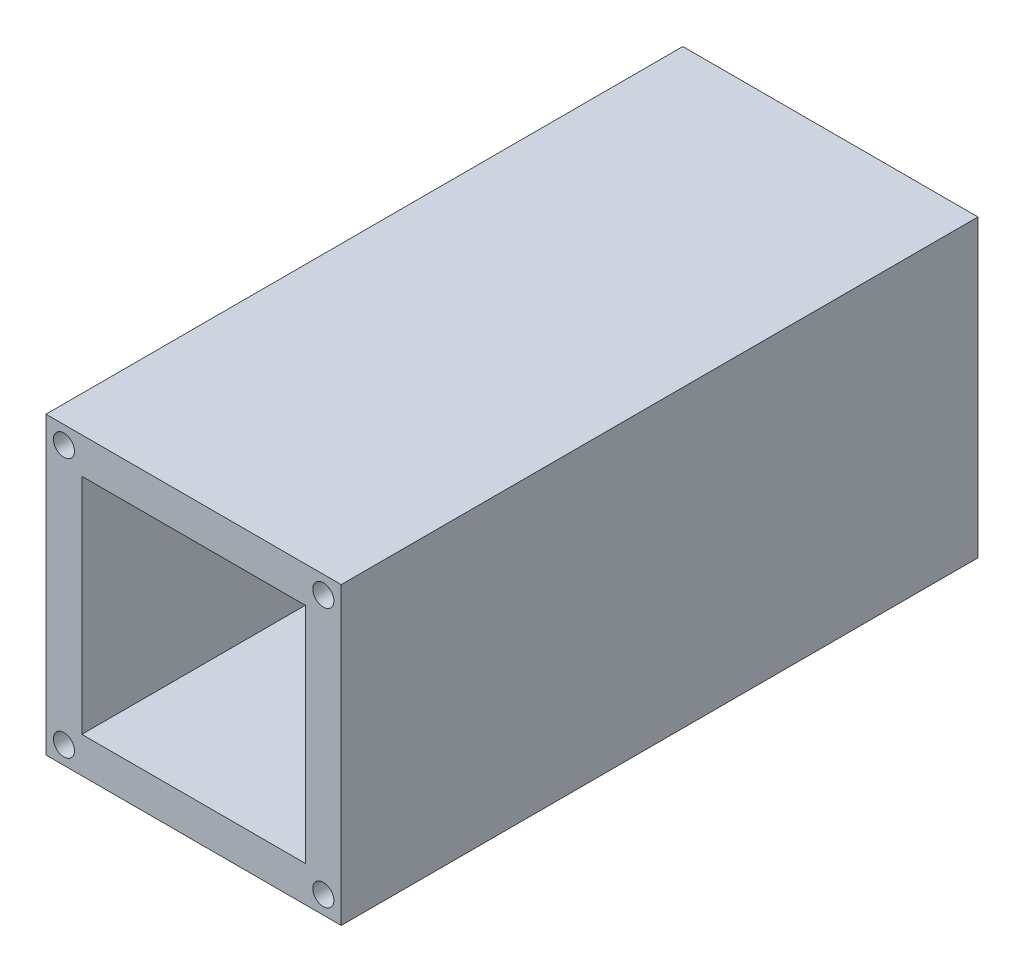
ISO-10303-21;
HEADER;
FILE_DESCRIPTION(('STEP AP214'),'2;1');
FILE_NAME('part.step','',(''),(''),'','','');
FILE_SCHEMA(('AUTOMOTIVE_DESIGN { 1 0 10303 214 1 1 1 1 }'));
ENDSEC;
DATA;
#1=APPLICATION_CONTEXT('core data for automotive mechanical design processes');
#2=APPLICATION_PROTOCOL_DEFINITION('international standard','automotive_design',2000,#1);
#3=PRODUCT_CONTEXT('',#1,'mechanical');
#4=PRODUCT('Part','Part','',(#3));
#5=PRODUCT_RELATED_PRODUCT_CATEGORY('part','',(#4));
#6=PRODUCT_DEFINITION_FORMATION('','',#4);
#7=PRODUCT_DEFINITION_CONTEXT('part definition',#1,'design');
#8=PRODUCT_DEFINITION('design','',#6,#7);
#9=PRODUCT_DEFINITION_SHAPE('','',#8);
#10=(LENGTH_UNIT() NAMED_UNIT(*) SI_UNIT(.MILLI.,.METRE.));
#11=(NAMED_UNIT(*) PLANE_ANGLE_UNIT() SI_UNIT($,.RADIAN.));
#12=(NAMED_UNIT(*) SI_UNIT($,.STERADIAN.) SOLID_ANGLE_UNIT());
#13=UNCERTAINTY_MEASURE_WITH_UNIT(LENGTH_MEASURE(1.E-05),#10,'distance_accuracy_value','');
#14=(GEOMETRIC_REPRESENTATION_CONTEXT(3) GLOBAL_UNCERTAINTY_ASSIGNED_CONTEXT((#13)) GLOBAL_UNIT_ASSIGNED_CONTEXT((#10,
#11,#12)) REPRESENTATION_CONTEXT('',''));
#15=CARTESIAN_POINT('',(0.,0.,0.));
#16=DIRECTION('',(0.,0.,1.));
#17=DIRECTION('',(1.,0.,0.));
#18=AXIS2_PLACEMENT_3D('',#15,#16,#17);
#19=CARTESIAN_POINT('',(0.,0.,37.));
#20=DIRECTION('',(0.,0.,1.));
#21=DIRECTION('',(1.,0.,0.));
#22=AXIS2_PLACEMENT_3D('',#19,#20,#21);
#23=PLANE('',#22);
#24=DIRECTION('',(0.,-1.,0.));
#25=VECTOR('',#24,1.);
#26=CARTESIAN_POINT('',(13.25,-13.25,37.));
#27=LINE('',#26,#25);
#28=CARTESIAN_POINT('',(13.25,-5.07229280254794,37.));
#29=VERTEX_POINT('',#28);
#30=CARTESIAN_POINT('',(13.25,-13.25,37.));
#31=VERTEX_POINT('',#30);
#32=EDGE_CURVE('E256',#29,#31,#27,.T.);
#33=ORIENTED_EDGE('',*,*,#32,.F.);
#34=DIRECTION('',(-0.809445742860398,-0.587194677568843,0.));
#35=VECTOR('',#34,1.);
#36=CARTESIAN_POINT('',(6.97944014943826,-9.62113304552116,37.));
#37=LINE('',#36,#35);
#38=CARTESIAN_POINT('',(8.314710178981,-8.65249066104956,37.));
#39=VERTEX_POINT('',#38);
#40=EDGE_CURVE('E207',#29,#39,#37,.T.);
#41=ORIENTED_EDGE('',*,*,#40,.T.);
#42=CARTESIAN_POINT('',(0.,2.80930729897218,37.));
#43=DIRECTION('',(0.,0.,1.));
#44=DIRECTION('',(1.,0.,0.));
#45=AXIS2_PLACEMENT_3D('',#42,#43,#44);
#46=CIRCLE('',#45,14.1600571268907);
#47=CARTESIAN_POINT('',(-8.314710178981,-8.65249066104956,37.));
#48=VERTEX_POINT('',#47);
#49=EDGE_CURVE('E175',#39,#48,#46,.F.);
#50=ORIENTED_EDGE('',*,*,#49,.T.);
#51=DIRECTION('',(0.809445742860399,-0.587194677568843,0.));
#52=VECTOR('',#51,1.);
#53=CARTESIAN_POINT('',(-6.97944014943825,-9.62113304552117,37.));
#54=LINE('',#53,#52);
#55=CARTESIAN_POINT('',(-13.25,-5.07229280254795,37.));
#56=VERTEX_POINT('',#55);
#57=EDGE_CURVE('E180',#56,#48,#54,.T.);
#58=ORIENTED_EDGE('',*,*,#57,.F.);
#59=DIRECTION('',(0.,1.,0.));
#60=VECTOR('',#59,1.);
#61=CARTESIAN_POINT('',(-13.25,-13.25,37.));
#62=LINE('',#61,#60);
#63=CARTESIAN_POINT('',(-13.25,-13.25,37.));
#64=VERTEX_POINT('',#63);
#65=EDGE_CURVE('E270',#64,#56,#62,.T.);
#66=ORIENTED_EDGE('',*,*,#65,.F.);
#67=DIRECTION('',(-1.,0.,0.));
#68=VECTOR('',#67,1.);
#69=CARTESIAN_POINT('',(13.25,-13.25,37.));
#70=LINE('',#69,#68);
#71=EDGE_CURVE('E266',#31,#64,#70,.T.);
#72=ORIENTED_EDGE('',*,*,#71,.F.);
#73=EDGE_LOOP('',(#33,#41,#50,#58,#66,#72));
#74=FACE_BOUND('',#73,.T.);
#75=ADVANCED_FACE('F35',(#74),#23,.T.);
#76=CARTESIAN_POINT('',(0.,0.,30.));
#77=DIRECTION('',(0.,0.,-1.));
#78=DIRECTION('',(-1.,0.,0.));
#79=AXIS2_PLACEMENT_3D('',#76,#77,#78);
#80=PLANE('',#79);
#81=DIRECTION('',(0.80379313045912,0.594908903469034,0.));
#82=VECTOR('',#81,1.);
#83=CARTESIAN_POINT('',(-7.08019389577977,9.56618934858924,30.));
#84=LINE('',#83,#82);
#85=CARTESIAN_POINT('',(-13.25,4.9997499937495,30.));
#86=VERTEX_POINT('',#85);
#87=CARTESIAN_POINT('',(-8.314710178981,8.65249066104956,30.));
#88=VERTEX_POINT('',#87);
#89=EDGE_CURVE('E203',#86,#88,#84,.T.);
#90=ORIENTED_EDGE('',*,*,#89,.F.);
#91=DIRECTION('',(0.,1.,0.));
#92=VECTOR('',#91,1.);
#93=CARTESIAN_POINT('',(-13.25,-13.25,30.));
#94=LINE('',#93,#92);
#95=CARTESIAN_POINT('',(-13.25,13.25,30.));
#96=VERTEX_POINT('',#95);
#97=EDGE_CURVE('E237',#86,#96,#94,.T.);
#98=ORIENTED_EDGE('',*,*,#97,.T.);
#99=DIRECTION('',(1.,0.,0.));
#100=VECTOR('',#99,1.);
#101=CARTESIAN_POINT('',(-13.25,13.25,30.));
#102=LINE('',#101,#100);
#103=CARTESIAN_POINT('',(13.25,13.25,30.));
#104=VERTEX_POINT('',#103);
#105=EDGE_CURVE('E240',#96,#104,#102,.T.);
#106=ORIENTED_EDGE('',*,*,#105,.T.);
#107=DIRECTION('',(0.,-1.,0.));
#108=VECTOR('',#107,1.);
#109=CARTESIAN_POINT('',(13.25,-13.25,30.));
#110=LINE('',#109,#108);
#111=CARTESIAN_POINT('',(13.25,4.99974999374959,30.));
#112=VERTEX_POINT('',#111);
#113=EDGE_CURVE('E230',#104,#112,#110,.T.);
#114=ORIENTED_EDGE('',*,*,#113,.T.);
#115=DIRECTION('',(-0.80379313045912,0.594908903469034,0.));
#116=VECTOR('',#115,1.);
#117=CARTESIAN_POINT('',(7.08019389577977,9.56618934858924,30.));
#118=LINE('',#117,#116);
#119=CARTESIAN_POINT('',(8.314710178981,8.65249066104955,30.));
#120=VERTEX_POINT('',#119);
#121=EDGE_CURVE('E195',#112,#120,#118,.T.);
#122=ORIENTED_EDGE('',*,*,#121,.T.);
#123=CARTESIAN_POINT('',(0.,-2.58167793964163,30.));
#124=DIRECTION('',(0.,0.,-1.));
#125=DIRECTION('',(-1.,0.,0.));
#126=AXIS2_PLACEMENT_3D('',#123,#124,#125);
#127=CIRCLE('',#126,13.9764426628955);
#128=EDGE_CURVE('E200',#88,#120,#127,.T.);
#129=ORIENTED_EDGE('',*,*,#128,.F.);
#130=EDGE_LOOP('',(#90,#98,#106,#114,#122,#129));
#131=FACE_BOUND('',#130,.T.);
#132=ADVANCED_FACE('F395',(#131),#80,.T.);
#133=CARTESIAN_POINT('',(-17.5,-17.5,75.5));
#134=DIRECTION('',(1.,0.,0.));
#135=DIRECTION('',(0.,0.,-1.));
#136=AXIS2_PLACEMENT_3D('',#133,#134,#135);
#137=PLANE('',#136);
#138=DIRECTION('',(0.,-1.,0.));
#139=VECTOR('',#138,1.);
#140=CARTESIAN_POINT('',(-17.5,-17.5,0.));
#141=LINE('',#140,#139);
#142=CARTESIAN_POINT('',(-17.5,17.5,0.));
#143=VERTEX_POINT('',#142);
#144=CARTESIAN_POINT('',(-17.5,-17.5,0.));
#145=VERTEX_POINT('',#144);
#146=EDGE_CURVE('E339',#143,#145,#141,.T.);
#147=ORIENTED_EDGE('',*,*,#146,.T.);
#148=DIRECTION('',(0.,0.,-1.));
#149=VECTOR('',#148,1.);
#150=CARTESIAN_POINT('',(-17.5,-17.5,75.5));
#151=LINE('',#150,#149);
#152=CARTESIAN_POINT('',(-17.5,-17.5,75.5));
#153=VERTEX_POINT('',#152);
#154=EDGE_CURVE('E11',#153,#145,#151,.T.);
#155=ORIENTED_EDGE('',*,*,#154,.F.);
#156=DIRECTION('',(0.,-1.,0.));
#157=VECTOR('',#156,1.);
#158=CARTESIAN_POINT('',(-17.5,-17.5,75.5));
#159=LINE('',#158,#157);
#160=CARTESIAN_POINT('',(-17.5,17.5,75.5));
#161=VERTEX_POINT('',#160);
#162=EDGE_CURVE('E345',#161,#153,#159,.T.);
#163=ORIENTED_EDGE('',*,*,#162,.F.);
#164=DIRECTION('',(0.,0.,-1.));
#165=VECTOR('',#164,1.);
#166=CARTESIAN_POINT('',(-17.5,17.5,75.5));
#167=LINE('',#166,#165);
#168=EDGE_CURVE('E355',#161,#143,#167,.T.);
#169=ORIENTED_EDGE('',*,*,#168,.T.);
#170=EDGE_LOOP('',(#147,#155,#163,#169));
#171=FACE_BOUND('',#170,.T.);
#172=ADVANCED_FACE('F37',(#171),#137,.F.);
#173=CARTESIAN_POINT('',(17.5,-17.5,75.5));
#174=DIRECTION('',(0.,1.,0.));
#175=DIRECTION('',(-1.,0.,0.));
#176=AXIS2_PLACEMENT_3D('',#173,#174,#175);
#177=PLANE('',#176);
#178=DIRECTION('',(1.,0.,0.));
#179=VECTOR('',#178,1.);
#180=CARTESIAN_POINT('',(17.5,-17.5,0.));
#181=LINE('',#180,#179);
#182=CARTESIAN_POINT('',(17.5,-17.5,0.));
#183=VERTEX_POINT('',#182);
#184=EDGE_CURVE('E358',#145,#183,#181,.T.);
#185=ORIENTED_EDGE('',*,*,#184,.T.);
#186=DIRECTION('',(0.,0.,-1.));
#187=VECTOR('',#186,1.);
#188=CARTESIAN_POINT('',(17.5,-17.5,75.5));
#189=LINE('',#188,#187);
#190=CARTESIAN_POINT('',(17.5,-17.5,75.5));
#191=VERTEX_POINT('',#190);
#192=EDGE_CURVE('E43',#191,#183,#189,.T.);
#193=ORIENTED_EDGE('',*,*,#192,.F.);
#194=DIRECTION('',(1.,0.,0.));
#195=VECTOR('',#194,1.);
#196=CARTESIAN_POINT('',(17.5,-17.5,75.5));
#197=LINE('',#196,#195);
#198=EDGE_CURVE('E348',#153,#191,#197,.T.);
#199=ORIENTED_EDGE('',*,*,#198,.F.);
#200=ORIENTED_EDGE('',*,*,#154,.T.);
#201=EDGE_LOOP('',(#185,#193,#199,#200));
#202=FACE_BOUND('',#201,.T.);
#203=ADVANCED_FACE('F388',(#202),#177,.F.);
#204=CARTESIAN_POINT('',(17.5,-17.5,75.5));
#205=DIRECTION('',(-1.,0.,0.));
#206=DIRECTION('',(0.,-1.,0.));
#207=AXIS2_PLACEMENT_3D('',#204,#205,#206);
#208=PLANE('',#207);
#209=DIRECTION('',(0.,1.,0.));
#210=VECTOR('',#209,1.);
#211=CARTESIAN_POINT('',(17.5,-17.5,0.));
#212=LINE('',#211,#210);
#213=CARTESIAN_POINT('',(17.5,17.5,0.));
#214=VERTEX_POINT('',#213);
#215=EDGE_CURVE('E360',#183,#214,#212,.T.);
#216=ORIENTED_EDGE('',*,*,#215,.T.);
#217=DIRECTION('',(0.,0.,-1.));
#218=VECTOR('',#217,1.);
#219=CARTESIAN_POINT('',(17.5,17.5,75.5));
#220=LINE('',#219,#218);
#221=CARTESIAN_POINT('',(17.5,17.5,75.5));
#222=VERTEX_POINT('',#221);
#223=EDGE_CURVE('E365',#222,#214,#220,.T.);
#224=ORIENTED_EDGE('',*,*,#223,.F.);
#225=DIRECTION('',(0.,1.,0.));
#226=VECTOR('',#225,1.);
#227=CARTESIAN_POINT('',(17.5,-17.5,75.5));
#228=LINE('',#227,#226);
#229=EDGE_CURVE('E351',#191,#222,#228,.T.);
#230=ORIENTED_EDGE('',*,*,#229,.F.);
#231=ORIENTED_EDGE('',*,*,#192,.T.);
#232=EDGE_LOOP('',(#216,#224,#230,#231));
#233=FACE_BOUND('',#232,.T.);
#234=ADVANCED_FACE('F372',(#233),#208,.F.);
#235=CARTESIAN_POINT('',(17.5,17.5,75.5));
#236=DIRECTION('',(0.,-1.,0.));
#237=DIRECTION('',(1.,0.,0.));
#238=AXIS2_PLACEMENT_3D('',#235,#236,#237);
#239=PLANE('',#238);
#240=DIRECTION('',(-1.,0.,0.));
#241=VECTOR('',#240,1.);
#242=CARTESIAN_POINT('',(17.5,17.5,0.));
#243=LINE('',#242,#241);
#244=EDGE_CURVE('E349',#214,#143,#243,.T.);
#245=ORIENTED_EDGE('',*,*,#244,.T.);
#246=ORIENTED_EDGE('',*,*,#168,.F.);
#247=DIRECTION('',(-1.,0.,0.));
#248=VECTOR('',#247,1.);
#249=CARTESIAN_POINT('',(17.5,17.5,75.5));
#250=LINE('',#249,#248);
#251=EDGE_CURVE('E353',#222,#161,#250,.T.);
#252=ORIENTED_EDGE('',*,*,#251,.F.);
#253=ORIENTED_EDGE('',*,*,#223,.T.);
#254=EDGE_LOOP('',(#245,#246,#252,#253));
#255=FACE_BOUND('',#254,.T.);
#256=ADVANCED_FACE('F381',(#255),#239,.F.);
#257=CARTESIAN_POINT('',(0.,0.,75.5));
#258=DIRECTION('',(0.,0.,1.));
#259=DIRECTION('',(1.,0.,0.));
#260=AXIS2_PLACEMENT_3D('',#257,#258,#259);
#261=PLANE('',#260);
#262=CARTESIAN_POINT('',(-15.375,-15.38,75.5));
#263=DIRECTION('',(0.,0.,1.));
#264=DIRECTION('',(1.,0.,0.));
#265=AXIS2_PLACEMENT_3D('',#262,#263,#264);
#266=CIRCLE('',#265,1.25);
#267=CARTESIAN_POINT('',(-14.125,-15.38,75.5));
#268=VERTEX_POINT('',#267);
#269=EDGE_CURVE('E298',#268,#268,#266,.T.);
#270=ORIENTED_EDGE('',*,*,#269,.F.);
#271=EDGE_LOOP('',(#270));
#272=FACE_BOUND('',#271,.T.);
#273=CARTESIAN_POINT('',(15.38,-15.38,75.5));
#274=DIRECTION('',(0.,0.,1.));
#275=DIRECTION('',(1.,0.,0.));
#276=AXIS2_PLACEMENT_3D('',#273,#274,#275);
#277=CIRCLE('',#276,1.25);
#278=CARTESIAN_POINT('',(16.63,-15.38,75.5));
#279=VERTEX_POINT('',#278);
#280=EDGE_CURVE('E311',#279,#279,#277,.T.);
#281=ORIENTED_EDGE('',*,*,#280,.F.);
#282=EDGE_LOOP('',(#281));
#283=FACE_BOUND('',#282,.T.);
#284=CARTESIAN_POINT('',(15.38,15.38,75.5));
#285=DIRECTION('',(0.,0.,1.));
#286=DIRECTION('',(1.,0.,0.));
#287=AXIS2_PLACEMENT_3D('',#284,#285,#286);
#288=CIRCLE('',#287,1.25);
#289=CARTESIAN_POINT('',(16.63,15.38,75.5));
#290=VERTEX_POINT('',#289);
#291=EDGE_CURVE('E305',#290,#290,#288,.T.);
#292=ORIENTED_EDGE('',*,*,#291,.F.);
#293=EDGE_LOOP('',(#292));
#294=FACE_BOUND('',#293,.T.);
#295=CARTESIAN_POINT('',(-15.375,15.38,75.5));
#296=DIRECTION('',(0.,0.,1.));
#297=DIRECTION('',(1.,0.,0.));
#298=AXIS2_PLACEMENT_3D('',#295,#296,#297);
#299=CIRCLE('',#298,1.25);
#300=CARTESIAN_POINT('',(-14.125,15.38,75.5));
#301=VERTEX_POINT('',#300);
#302=EDGE_CURVE('E304',#301,#301,#299,.T.);
#303=ORIENTED_EDGE('',*,*,#302,.F.);
#304=EDGE_LOOP('',(#303));
#305=FACE_BOUND('',#304,.T.);
#306=DIRECTION('',(0.,-1.,0.));
#307=VECTOR('',#306,1.);
#308=CARTESIAN_POINT('',(-13.25,-13.25,75.5));
#309=LINE('',#308,#307);
#310=CARTESIAN_POINT('',(-13.25,13.25,75.5));
#311=VERTEX_POINT('',#310);
#312=CARTESIAN_POINT('',(-13.25,-13.25,75.5));
#313=VERTEX_POINT('',#312);
#314=EDGE_CURVE('E322',#311,#313,#309,.T.);
#315=ORIENTED_EDGE('',*,*,#314,.F.);
#316=DIRECTION('',(-1.,0.,0.));
#317=VECTOR('',#316,1.);
#318=CARTESIAN_POINT('',(13.25,13.25,75.5));
#319=LINE('',#318,#317);
#320=CARTESIAN_POINT('',(13.25,13.25,75.5));
#321=VERTEX_POINT('',#320);
#322=EDGE_CURVE('E333',#321,#311,#319,.T.);
#323=ORIENTED_EDGE('',*,*,#322,.F.);
#324=DIRECTION('',(0.,1.,0.));
#325=VECTOR('',#324,1.);
#326=CARTESIAN_POINT('',(13.25,-13.25,75.5));
#327=LINE('',#326,#325);
#328=CARTESIAN_POINT('',(13.25,-13.25,75.5));
#329=VERTEX_POINT('',#328);
#330=EDGE_CURVE('E330',#329,#321,#327,.T.);
#331=ORIENTED_EDGE('',*,*,#330,.F.);
#332=DIRECTION('',(1.,0.,0.));
#333=VECTOR('',#332,1.);
#334=CARTESIAN_POINT('',(13.25,-13.25,75.5));
#335=LINE('',#334,#333);
#336=EDGE_CURVE('E327',#313,#329,#335,.T.);
#337=ORIENTED_EDGE('',*,*,#336,.F.);
#338=EDGE_LOOP('',(#315,#323,#331,#337));
#339=FACE_BOUND('',#338,.T.);
#340=ORIENTED_EDGE('',*,*,#162,.T.);
#341=ORIENTED_EDGE('',*,*,#198,.T.);
#342=ORIENTED_EDGE('',*,*,#229,.T.);
#343=ORIENTED_EDGE('',*,*,#251,.T.);
#344=EDGE_LOOP('',(#340,#341,#342,#343));
#345=FACE_BOUND('',#344,.T.);
#346=ADVANCED_FACE('F387',(#272,#283,#294,#305,#339,#345),#261,.T.);
#347=CARTESIAN_POINT('',(0.,0.,0.));
#348=DIRECTION('',(0.,0.,1.));
#349=DIRECTION('',(1.,0.,0.));
#350=AXIS2_PLACEMENT_3D('',#347,#348,#349);
#351=PLANE('',#350);
#352=DIRECTION('',(-1.,0.,0.));
#353=VECTOR('',#352,1.);
#354=CARTESIAN_POINT('',(-13.25,-13.25,0.));
#355=LINE('',#354,#353);
#356=CARTESIAN_POINT('',(13.25,-13.25,0.));
#357=VERTEX_POINT('',#356);
#358=CARTESIAN_POINT('',(-13.25,-13.25,0.));
#359=VERTEX_POINT('',#358);
#360=EDGE_CURVE('E245',#357,#359,#355,.T.);
#361=ORIENTED_EDGE('',*,*,#360,.F.);
#362=DIRECTION('',(0.,-1.,0.));
#363=VECTOR('',#362,1.);
#364=CARTESIAN_POINT('',(13.25,-13.25,0.));
#365=LINE('',#364,#363);
#366=CARTESIAN_POINT('',(13.25,13.25,0.));
#367=VERTEX_POINT('',#366);
#368=EDGE_CURVE('E187',#367,#357,#365,.T.);
#369=ORIENTED_EDGE('',*,*,#368,.F.);
#370=DIRECTION('',(1.,0.,0.));
#371=VECTOR('',#370,1.);
#372=CARTESIAN_POINT('',(-13.25,13.25,0.));
#373=LINE('',#372,#371);
#374=CARTESIAN_POINT('',(-13.25,13.25,0.));
#375=VERTEX_POINT('',#374);
#376=EDGE_CURVE('E251',#375,#367,#373,.T.);
#377=ORIENTED_EDGE('',*,*,#376,.F.);
#378=DIRECTION('',(0.,1.,0.));
#379=VECTOR('',#378,1.);
#380=CARTESIAN_POINT('',(-13.25,-13.25,0.));
#381=LINE('',#380,#379);
#382=EDGE_CURVE('E248',#359,#375,#381,.T.);
#383=ORIENTED_EDGE('',*,*,#382,.F.);
#384=EDGE_LOOP('',(#361,#369,#377,#383));
#385=FACE_BOUND('',#384,.T.);
#386=CARTESIAN_POINT('',(15.38,-15.38,0.));
#387=DIRECTION('',(0.,0.,-1.));
#388=DIRECTION('',(-1.,0.,0.));
#389=AXIS2_PLACEMENT_3D('',#386,#387,#388);
#390=CIRCLE('',#389,1.25);
#391=CARTESIAN_POINT('',(14.13,-15.38,0.));
#392=VERTEX_POINT('',#391);
#393=EDGE_CURVE('E276',#392,#392,#390,.T.);
#394=ORIENTED_EDGE('',*,*,#393,.F.);
#395=EDGE_LOOP('',(#394));
#396=FACE_BOUND('',#395,.T.);
#397=CARTESIAN_POINT('',(-15.38,-15.38,0.));
#398=DIRECTION('',(0.,0.,-1.));
#399=DIRECTION('',(-1.,0.,0.));
#400=AXIS2_PLACEMENT_3D('',#397,#398,#399);
#401=CIRCLE('',#400,1.25);
#402=CARTESIAN_POINT('',(-16.63,-15.38,0.));
#403=VERTEX_POINT('',#402);
#404=EDGE_CURVE('E287',#403,#403,#401,.T.);
#405=ORIENTED_EDGE('',*,*,#404,.F.);
#406=EDGE_LOOP('',(#405));
#407=FACE_BOUND('',#406,.T.);
#408=CARTESIAN_POINT('',(-15.38,15.38,0.));
#409=DIRECTION('',(0.,0.,-1.));
#410=DIRECTION('',(-1.,0.,0.));
#411=AXIS2_PLACEMENT_3D('',#408,#409,#410);
#412=CIRCLE('',#411,1.25);
#413=CARTESIAN_POINT('',(-16.63,15.38,0.));
#414=VERTEX_POINT('',#413);
#415=EDGE_CURVE('E281',#414,#414,#412,.T.);
#416=ORIENTED_EDGE('',*,*,#415,.F.);
#417=EDGE_LOOP('',(#416));
#418=FACE_BOUND('',#417,.T.);
#419=CARTESIAN_POINT('',(15.38,15.38,0.));
#420=DIRECTION('',(0.,0.,-1.));
#421=DIRECTION('',(-1.,0.,0.));
#422=AXIS2_PLACEMENT_3D('',#419,#420,#421);
#423=CIRCLE('',#422,1.25);
#424=CARTESIAN_POINT('',(14.13,15.38,0.));
#425=VERTEX_POINT('',#424);
#426=EDGE_CURVE('E280',#425,#425,#423,.T.);
#427=ORIENTED_EDGE('',*,*,#426,.F.);
#428=EDGE_LOOP('',(#427));
#429=FACE_BOUND('',#428,.T.);
#430=ORIENTED_EDGE('',*,*,#146,.F.);
#431=ORIENTED_EDGE('',*,*,#244,.F.);
#432=ORIENTED_EDGE('',*,*,#215,.F.);
#433=ORIENTED_EDGE('',*,*,#184,.F.);
#434=EDGE_LOOP('',(#430,#431,#432,#433));
#435=FACE_BOUND('',#434,.T.);
#436=ADVANCED_FACE('F378',(#385,#396,#407,#418,#429,#435),#351,.F.);
#437=CARTESIAN_POINT('',(-13.25,-13.25,-4.5));
#438=DIRECTION('',(-1.,0.,0.));
#439=DIRECTION('',(0.,0.,1.));
#440=AXIS2_PLACEMENT_3D('',#437,#438,#439);
#441=PLANE('',#440);
#442=DIRECTION('',(0.,0.,1.));
#443=VECTOR('',#442,1.);
#444=CARTESIAN_POINT('',(-13.25,-13.25,-4.5));
#445=LINE('',#444,#443);
#446=EDGE_CURVE('E336',#64,#313,#445,.T.);
#447=ORIENTED_EDGE('',*,*,#446,.F.);
#448=ORIENTED_EDGE('',*,*,#65,.T.);
#449=DIRECTION('',(0.,0.,1.));
#450=VECTOR('',#449,1.);
#451=CARTESIAN_POINT('',(-13.25,-5.07229280254795,-0.001000000000001));
#452=LINE('',#451,#450);
#453=CARTESIAN_POINT('',(-13.25,-5.07229280254795,30.));
#454=VERTEX_POINT('',#453);
#455=EDGE_CURVE('E50',#454,#56,#452,.T.);
#456=ORIENTED_EDGE('',*,*,#455,.F.);
#457=CARTESIAN_POINT('',(-13.25,-13.25,30.));
#458=VERTEX_POINT('',#457);
#459=EDGE_CURVE('E238',#458,#454,#94,.T.);
#460=ORIENTED_EDGE('',*,*,#459,.F.);
#461=DIRECTION('',(0.,0.,-1.));
#462=VECTOR('',#461,1.);
#463=CARTESIAN_POINT('',(-13.25,-13.25,30.));
#464=LINE('',#463,#462);
#465=EDGE_CURVE('E259',#458,#359,#464,.T.);
#466=ORIENTED_EDGE('',*,*,#465,.T.);
#467=ORIENTED_EDGE('',*,*,#382,.T.);
#468=DIRECTION('',(0.,0.,-1.));
#469=VECTOR('',#468,1.);
#470=CARTESIAN_POINT('',(-13.25,13.25,30.));
#471=LINE('',#470,#469);
#472=EDGE_CURVE('E257',#96,#375,#471,.T.);
#473=ORIENTED_EDGE('',*,*,#472,.F.);
#474=ORIENTED_EDGE('',*,*,#97,.F.);
#475=DIRECTION('',(0.,0.,1.));
#476=VECTOR('',#475,1.);
#477=CARTESIAN_POINT('',(-13.25,4.9997499937495,-0.001000000000001));
#478=LINE('',#477,#476);
#479=CARTESIAN_POINT('',(-13.25,4.9997499937495,37.));
#480=VERTEX_POINT('',#479);
#481=EDGE_CURVE('E221',#86,#480,#478,.T.);
#482=ORIENTED_EDGE('',*,*,#481,.T.);
#483=CARTESIAN_POINT('',(-13.25,13.25,37.));
#484=VERTEX_POINT('',#483);
#485=EDGE_CURVE('E269',#480,#484,#62,.T.);
#486=ORIENTED_EDGE('',*,*,#485,.T.);
#487=DIRECTION('',(0.,0.,1.));
#488=VECTOR('',#487,1.);
#489=CARTESIAN_POINT('',(-13.25,13.25,-4.5));
#490=LINE('',#489,#488);
#491=EDGE_CURVE('E337',#484,#311,#490,.T.);
#492=ORIENTED_EDGE('',*,*,#491,.T.);
#493=ORIENTED_EDGE('',*,*,#314,.T.);
#494=EDGE_LOOP('',(#447,#448,#456,#460,#466,#467,#473,#474,#482,#486,#492,#493));
#495=FACE_BOUND('',#494,.T.);
#496=ADVANCED_FACE('F441',(#495),#441,.F.);
#497=CARTESIAN_POINT('',(13.25,13.25,-4.5));
#498=DIRECTION('',(0.,1.,0.));
#499=DIRECTION('',(-1.,0.,0.));
#500=AXIS2_PLACEMENT_3D('',#497,#498,#499);
#501=PLANE('',#500);
#502=ORIENTED_EDGE('',*,*,#491,.F.);
#503=DIRECTION('',(1.,0.,0.));
#504=VECTOR('',#503,1.);
#505=CARTESIAN_POINT('',(13.25,13.25,37.));
#506=LINE('',#505,#504);
#507=CARTESIAN_POINT('',(13.25,13.25,37.));
#508=VERTEX_POINT('',#507);
#509=EDGE_CURVE('E273',#484,#508,#506,.T.);
#510=ORIENTED_EDGE('',*,*,#509,.T.);
#511=DIRECTION('',(0.,0.,1.));
#512=VECTOR('',#511,1.);
#513=CARTESIAN_POINT('',(13.25,13.25,-4.5));
#514=LINE('',#513,#512);
#515=EDGE_CURVE('E340',#508,#321,#514,.T.);
#516=ORIENTED_EDGE('',*,*,#515,.T.);
#517=ORIENTED_EDGE('',*,*,#322,.T.);
#518=EDGE_LOOP('',(#502,#510,#516,#517));
#519=FACE_BOUND('',#518,.T.);
#520=ADVANCED_FACE('F435',(#519),#501,.F.);
#521=CARTESIAN_POINT('',(13.25,-13.25,-4.5));
#522=DIRECTION('',(1.,0.,0.));
#523=DIRECTION('',(0.,0.,-1.));
#524=AXIS2_PLACEMENT_3D('',#521,#522,#523);
#525=PLANE('',#524);
#526=ORIENTED_EDGE('',*,*,#515,.F.);
#527=CARTESIAN_POINT('',(13.25,4.99974999374959,37.));
#528=VERTEX_POINT('',#527);
#529=EDGE_CURVE('E263',#508,#528,#27,.T.);
#530=ORIENTED_EDGE('',*,*,#529,.T.);
#531=DIRECTION('',(0.,0.,1.));
#532=VECTOR('',#531,1.);
#533=CARTESIAN_POINT('',(13.25,4.99974999374959,-0.001000000000001));
#534=LINE('',#533,#532);
#535=EDGE_CURVE('E227',#112,#528,#534,.T.);
#536=ORIENTED_EDGE('',*,*,#535,.F.);
#537=ORIENTED_EDGE('',*,*,#113,.F.);
#538=DIRECTION('',(0.,0.,-1.));
#539=VECTOR('',#538,1.);
#540=CARTESIAN_POINT('',(13.25,13.25,30.));
#541=LINE('',#540,#539);
#542=EDGE_CURVE('E254',#104,#367,#541,.T.);
#543=ORIENTED_EDGE('',*,*,#542,.T.);
#544=ORIENTED_EDGE('',*,*,#368,.T.);
#545=DIRECTION('',(0.,0.,-1.));
#546=VECTOR('',#545,1.);
#547=CARTESIAN_POINT('',(13.25,-13.25,30.));
#548=LINE('',#547,#546);
#549=CARTESIAN_POINT('',(13.25,-13.25,30.));
#550=VERTEX_POINT('',#549);
#551=EDGE_CURVE('E243',#550,#357,#548,.T.);
#552=ORIENTED_EDGE('',*,*,#551,.F.);
#553=CARTESIAN_POINT('',(13.25,-5.07229280254794,30.));
#554=VERTEX_POINT('',#553);
#555=EDGE_CURVE('E234',#554,#550,#110,.T.);
#556=ORIENTED_EDGE('',*,*,#555,.F.);
#557=DIRECTION('',(0.,0.,1.));
#558=VECTOR('',#557,1.);
#559=CARTESIAN_POINT('',(13.25,-5.07229280254794,-0.001000000000001));
#560=LINE('',#559,#558);
#561=EDGE_CURVE('E179',#554,#29,#560,.T.);
#562=ORIENTED_EDGE('',*,*,#561,.T.);
#563=ORIENTED_EDGE('',*,*,#32,.T.);
#564=DIRECTION('',(0.,0.,1.));
#565=VECTOR('',#564,1.);
#566=CARTESIAN_POINT('',(13.25,-13.25,-4.5));
#567=LINE('',#566,#565);
#568=EDGE_CURVE('E342',#31,#329,#567,.T.);
#569=ORIENTED_EDGE('',*,*,#568,.T.);
#570=ORIENTED_EDGE('',*,*,#330,.T.);
#571=EDGE_LOOP('',(#526,#530,#536,#537,#543,#544,#552,#556,#562,#563,#569,#570));
#572=FACE_BOUND('',#571,.T.);
#573=ADVANCED_FACE('F428',(#572),#525,.F.);
#574=CARTESIAN_POINT('',(13.25,-13.25,-4.5));
#575=DIRECTION('',(0.,-1.,0.));
#576=DIRECTION('',(1.,0.,0.));
#577=AXIS2_PLACEMENT_3D('',#574,#575,#576);
#578=PLANE('',#577);
#579=ORIENTED_EDGE('',*,*,#568,.F.);
#580=ORIENTED_EDGE('',*,*,#71,.T.);
#581=ORIENTED_EDGE('',*,*,#446,.T.);
#582=ORIENTED_EDGE('',*,*,#336,.T.);
#583=EDGE_LOOP('',(#579,#580,#581,#582));
#584=FACE_BOUND('',#583,.T.);
#585=ADVANCED_FACE('F467',(#584),#578,.F.);
#586=CARTESIAN_POINT('',(-15.375,15.38,65.5));
#587=DIRECTION('',(0.,0.,1.));
#588=DIRECTION('',(1.,0.,0.));
#589=AXIS2_PLACEMENT_3D('',#586,#587,#588);
#590=CYLINDRICAL_SURFACE('',#589,1.25);
#591=CARTESIAN_POINT('',(-15.375,15.38,65.5));
#592=DIRECTION('',(0.,0.,1.));
#593=DIRECTION('',(1.,0.,0.));
#594=AXIS2_PLACEMENT_3D('',#591,#592,#593);
#595=CIRCLE('',#594,1.25);
#596=CARTESIAN_POINT('',(-14.125,15.38,65.5));
#597=VERTEX_POINT('',#596);
#598=EDGE_CURVE('E319',#597,#597,#595,.T.);
#599=ORIENTED_EDGE('',*,*,#598,.F.);
#600=EDGE_LOOP('',(#599));
#601=FACE_BOUND('',#600,.T.);
#602=ORIENTED_EDGE('',*,*,#302,.T.);
#603=EDGE_LOOP('',(#602));
#604=FACE_BOUND('',#603,.T.);
#605=ADVANCED_FACE('F485',(#601,#604),#590,.F.);
#606=CARTESIAN_POINT('',(-15.375,15.38,65.5));
#607=DIRECTION('',(0.,0.,1.));
#608=DIRECTION('',(1.,0.,0.));
#609=AXIS2_PLACEMENT_3D('',#606,#607,#608);
#610=PLANE('',#609);
#611=ORIENTED_EDGE('',*,*,#598,.T.);
#612=EDGE_LOOP('',(#611));
#613=FACE_BOUND('',#612,.T.);
#614=ADVANCED_FACE('F492',(#613),#610,.T.);
#615=CARTESIAN_POINT('',(15.38,15.38,65.5));
#616=DIRECTION('',(0.,0.,1.));
#617=DIRECTION('',(1.,0.,0.));
#618=AXIS2_PLACEMENT_3D('',#615,#616,#617);
#619=CYLINDRICAL_SURFACE('',#618,1.25);
#620=CARTESIAN_POINT('',(15.38,15.38,65.5));
#621=DIRECTION('',(0.,0.,1.));
#622=DIRECTION('',(1.,0.,0.));
#623=AXIS2_PLACEMENT_3D('',#620,#621,#622);
#624=CIRCLE('',#623,1.25);
#625=CARTESIAN_POINT('',(16.63,15.38,65.5));
#626=VERTEX_POINT('',#625);
#627=EDGE_CURVE('E301',#626,#626,#624,.T.);
#628=ORIENTED_EDGE('',*,*,#627,.F.);
#629=EDGE_LOOP('',(#628));
#630=FACE_BOUND('',#629,.T.);
#631=ORIENTED_EDGE('',*,*,#291,.T.);
#632=EDGE_LOOP('',(#631));
#633=FACE_BOUND('',#632,.T.);
#634=ADVANCED_FACE('F496',(#630,#633),#619,.F.);
#635=CARTESIAN_POINT('',(15.38,15.38,65.5));
#636=DIRECTION('',(0.,0.,1.));
#637=DIRECTION('',(1.,0.,0.));
#638=AXIS2_PLACEMENT_3D('',#635,#636,#637);
#639=PLANE('',#638);
#640=ORIENTED_EDGE('',*,*,#627,.T.);
#641=EDGE_LOOP('',(#640));
#642=FACE_BOUND('',#641,.T.);
#643=ADVANCED_FACE('F511',(#642),#639,.T.);
#644=CARTESIAN_POINT('',(15.38,-15.38,65.5));
#645=DIRECTION('',(0.,0.,1.));
#646=DIRECTION('',(1.,0.,0.));
#647=AXIS2_PLACEMENT_3D('',#644,#645,#646);
#648=CYLINDRICAL_SURFACE('',#647,1.25);
#649=CARTESIAN_POINT('',(15.38,-15.38,65.5));
#650=DIRECTION('',(0.,0.,1.));
#651=DIRECTION('',(1.,0.,0.));
#652=AXIS2_PLACEMENT_3D('',#649,#650,#651);
#653=CIRCLE('',#652,1.25);
#654=CARTESIAN_POINT('',(16.63,-15.38,65.5));
#655=VERTEX_POINT('',#654);
#656=EDGE_CURVE('E308',#655,#655,#653,.T.);
#657=ORIENTED_EDGE('',*,*,#656,.F.);
#658=EDGE_LOOP('',(#657));
#659=FACE_BOUND('',#658,.T.);
#660=ORIENTED_EDGE('',*,*,#280,.T.);
#661=EDGE_LOOP('',(#660));
#662=FACE_BOUND('',#661,.T.);
#663=ADVANCED_FACE('F508',(#659,#662),#648,.F.);
#664=CARTESIAN_POINT('',(15.38,-15.38,65.5));
#665=DIRECTION('',(0.,0.,1.));
#666=DIRECTION('',(1.,0.,0.));
#667=AXIS2_PLACEMENT_3D('',#664,#665,#666);
#668=PLANE('',#667);
#669=ORIENTED_EDGE('',*,*,#656,.T.);
#670=EDGE_LOOP('',(#669));
#671=FACE_BOUND('',#670,.T.);
#672=ADVANCED_FACE('F502',(#671),#668,.T.);
#673=CARTESIAN_POINT('',(-15.375,-15.38,65.5));
#674=DIRECTION('',(0.,0.,1.));
#675=DIRECTION('',(1.,0.,0.));
#676=AXIS2_PLACEMENT_3D('',#673,#674,#675);
#677=CYLINDRICAL_SURFACE('',#676,1.25);
#678=CARTESIAN_POINT('',(-15.375,-15.38,65.5));
#679=DIRECTION('',(0.,0.,1.));
#680=DIRECTION('',(1.,0.,0.));
#681=AXIS2_PLACEMENT_3D('',#678,#679,#680);
#682=CIRCLE('',#681,1.25);
#683=CARTESIAN_POINT('',(-14.125,-15.38,65.5));
#684=VERTEX_POINT('',#683);
#685=EDGE_CURVE('E314',#684,#684,#682,.T.);
#686=ORIENTED_EDGE('',*,*,#685,.F.);
#687=EDGE_LOOP('',(#686));
#688=FACE_BOUND('',#687,.T.);
#689=ORIENTED_EDGE('',*,*,#269,.T.);
#690=EDGE_LOOP('',(#689));
#691=FACE_BOUND('',#690,.T.);
#692=ADVANCED_FACE('F498',(#688,#691),#677,.F.);
#693=CARTESIAN_POINT('',(-15.375,-15.38,65.5));
#694=DIRECTION('',(0.,0.,1.));
#695=DIRECTION('',(1.,0.,0.));
#696=AXIS2_PLACEMENT_3D('',#693,#694,#695);
#697=PLANE('',#696);
#698=ORIENTED_EDGE('',*,*,#685,.T.);
#699=EDGE_LOOP('',(#698));
#700=FACE_BOUND('',#699,.T.);
#701=ADVANCED_FACE('F501',(#700),#697,.T.);
#702=CARTESIAN_POINT('',(15.38,15.38,10.));
#703=DIRECTION('',(0.,0.,-1.));
#704=DIRECTION('',(-1.,0.,0.));
#705=AXIS2_PLACEMENT_3D('',#702,#703,#704);
#706=CYLINDRICAL_SURFACE('',#705,1.25);
#707=CARTESIAN_POINT('',(15.38,15.38,10.));
#708=DIRECTION('',(0.,0.,-1.));
#709=DIRECTION('',(-1.,0.,0.));
#710=AXIS2_PLACEMENT_3D('',#707,#708,#709);
#711=CIRCLE('',#710,1.25);
#712=CARTESIAN_POINT('',(14.13,15.38,10.));
#713=VERTEX_POINT('',#712);
#714=EDGE_CURVE('E295',#713,#713,#711,.T.);
#715=ORIENTED_EDGE('',*,*,#714,.F.);
#716=EDGE_LOOP('',(#715));
#717=FACE_BOUND('',#716,.T.);
#718=ORIENTED_EDGE('',*,*,#426,.T.);
#719=EDGE_LOOP('',(#718));
#720=FACE_BOUND('',#719,.T.);
#721=ADVANCED_FACE('F506',(#717,#720),#706,.F.);
#722=CARTESIAN_POINT('',(15.38,15.38,10.));
#723=DIRECTION('',(0.,0.,-1.));
#724=DIRECTION('',(-1.,0.,0.));
#725=AXIS2_PLACEMENT_3D('',#722,#723,#724);
#726=PLANE('',#725);
#727=ORIENTED_EDGE('',*,*,#714,.T.);
#728=EDGE_LOOP('',(#727));
#729=FACE_BOUND('',#728,.T.);
#730=ADVANCED_FACE('F524',(#729),#726,.T.);
#731=CARTESIAN_POINT('',(-15.38,15.38,10.));
#732=DIRECTION('',(0.,0.,-1.));
#733=DIRECTION('',(-1.,0.,0.));
#734=AXIS2_PLACEMENT_3D('',#731,#732,#733);
#735=CYLINDRICAL_SURFACE('',#734,1.25);
#736=CARTESIAN_POINT('',(-15.38,15.38,10.));
#737=DIRECTION('',(0.,0.,-1.));
#738=DIRECTION('',(-1.,0.,0.));
#739=AXIS2_PLACEMENT_3D('',#736,#737,#738);
#740=CIRCLE('',#739,1.25);
#741=CARTESIAN_POINT('',(-16.63,15.38,10.));
#742=VERTEX_POINT('',#741);
#743=EDGE_CURVE('E277',#742,#742,#740,.T.);
#744=ORIENTED_EDGE('',*,*,#743,.F.);
#745=EDGE_LOOP('',(#744));
#746=FACE_BOUND('',#745,.T.);
#747=ORIENTED_EDGE('',*,*,#415,.T.);
#748=EDGE_LOOP('',(#747));
#749=FACE_BOUND('',#748,.T.);
#750=ADVANCED_FACE('F528',(#746,#749),#735,.F.);
#751=CARTESIAN_POINT('',(-15.38,15.38,10.));
#752=DIRECTION('',(0.,0.,-1.));
#753=DIRECTION('',(-1.,0.,0.));
#754=AXIS2_PLACEMENT_3D('',#751,#752,#753);
#755=PLANE('',#754);
#756=ORIENTED_EDGE('',*,*,#743,.T.);
#757=EDGE_LOOP('',(#756));
#758=FACE_BOUND('',#757,.T.);
#759=ADVANCED_FACE('F537',(#758),#755,.T.);
#760=CARTESIAN_POINT('',(-15.38,-15.38,10.));
#761=DIRECTION('',(0.,0.,-1.));
#762=DIRECTION('',(-1.,0.,0.));
#763=AXIS2_PLACEMENT_3D('',#760,#761,#762);
#764=CYLINDRICAL_SURFACE('',#763,1.25);
#765=CARTESIAN_POINT('',(-15.38,-15.38,10.));
#766=DIRECTION('',(0.,0.,-1.));
#767=DIRECTION('',(-1.,0.,0.));
#768=AXIS2_PLACEMENT_3D('',#765,#766,#767);
#769=CIRCLE('',#768,1.25);
#770=CARTESIAN_POINT('',(-16.63,-15.38,10.));
#771=VERTEX_POINT('',#770);
#772=EDGE_CURVE('E284',#771,#771,#769,.T.);
#773=ORIENTED_EDGE('',*,*,#772,.F.);
#774=EDGE_LOOP('',(#773));
#775=FACE_BOUND('',#774,.T.);
#776=ORIENTED_EDGE('',*,*,#404,.T.);
#777=EDGE_LOOP('',(#776));
#778=FACE_BOUND('',#777,.T.);
#779=ADVANCED_FACE('F534',(#775,#778),#764,.F.);
#780=CARTESIAN_POINT('',(-15.38,-15.38,10.));
#781=DIRECTION('',(0.,0.,-1.));
#782=DIRECTION('',(-1.,0.,0.));
#783=AXIS2_PLACEMENT_3D('',#780,#781,#782);
#784=PLANE('',#783);
#785=ORIENTED_EDGE('',*,*,#772,.T.);
#786=EDGE_LOOP('',(#785));
#787=FACE_BOUND('',#786,.T.);
#788=ADVANCED_FACE('F531',(#787),#784,.T.);
#789=CARTESIAN_POINT('',(15.38,-15.38,10.));
#790=DIRECTION('',(0.,0.,-1.));
#791=DIRECTION('',(-1.,0.,0.));
#792=AXIS2_PLACEMENT_3D('',#789,#790,#791);
#793=CYLINDRICAL_SURFACE('',#792,1.25);
#794=CARTESIAN_POINT('',(15.38,-15.38,10.));
#795=DIRECTION('',(0.,0.,-1.));
#796=DIRECTION('',(-1.,0.,0.));
#797=AXIS2_PLACEMENT_3D('',#794,#795,#796);
#798=CIRCLE('',#797,1.25);
#799=CARTESIAN_POINT('',(14.13,-15.38,10.));
#800=VERTEX_POINT('',#799);
#801=EDGE_CURVE('E290',#800,#800,#798,.T.);
#802=ORIENTED_EDGE('',*,*,#801,.F.);
#803=EDGE_LOOP('',(#802));
#804=FACE_BOUND('',#803,.T.);
#805=ORIENTED_EDGE('',*,*,#393,.T.);
#806=EDGE_LOOP('',(#805));
#807=FACE_BOUND('',#806,.T.);
#808=ADVANCED_FACE('F419',(#804,#807),#793,.F.);
#809=CARTESIAN_POINT('',(15.38,-15.38,10.));
#810=DIRECTION('',(0.,0.,-1.));
#811=DIRECTION('',(-1.,0.,0.));
#812=AXIS2_PLACEMENT_3D('',#809,#810,#811);
#813=PLANE('',#812);
#814=ORIENTED_EDGE('',*,*,#801,.T.);
#815=EDGE_LOOP('',(#814));
#816=FACE_BOUND('',#815,.T.);
#817=ADVANCED_FACE('F410',(#816),#813,.T.);
#818=DIRECTION('',(-0.80379313045912,0.594908903469034,0.));
#819=VECTOR('',#818,1.);
#820=CARTESIAN_POINT('',(7.08019389577977,9.56618934858924,37.));
#821=LINE('',#820,#819);
#822=CARTESIAN_POINT('',(8.314710178981,8.65249066104955,37.));
#823=VERTEX_POINT('',#822);
#824=EDGE_CURVE('E209',#528,#823,#821,.T.);
#825=ORIENTED_EDGE('',*,*,#824,.F.);
#826=ORIENTED_EDGE('',*,*,#529,.F.);
#827=ORIENTED_EDGE('',*,*,#509,.F.);
#828=ORIENTED_EDGE('',*,*,#485,.F.);
#829=DIRECTION('',(0.80379313045912,0.594908903469034,0.));
#830=VECTOR('',#829,1.);
#831=CARTESIAN_POINT('',(-7.08019389577977,9.56618934858924,37.));
#832=LINE('',#831,#830);
#833=CARTESIAN_POINT('',(-8.314710178981,8.65249066104956,37.));
#834=VERTEX_POINT('',#833);
#835=EDGE_CURVE('E215',#480,#834,#832,.T.);
#836=ORIENTED_EDGE('',*,*,#835,.T.);
#837=CARTESIAN_POINT('',(0.,-2.58167793964163,37.));
#838=DIRECTION('',(0.,0.,1.));
#839=DIRECTION('',(1.,0.,0.));
#840=AXIS2_PLACEMENT_3D('',#837,#838,#839);
#841=CIRCLE('',#840,13.9764426628955);
#842=EDGE_CURVE('E212',#834,#823,#841,.F.);
#843=ORIENTED_EDGE('',*,*,#842,.T.);
#844=EDGE_LOOP('',(#825,#826,#827,#828,#836,#843));
#845=FACE_BOUND('',#844,.T.);
#846=ADVANCED_FACE('F399',(#845),#23,.T.);
#847=CARTESIAN_POINT('',(-13.25,13.25,30.));
#848=DIRECTION('',(0.,1.,0.));
#849=DIRECTION('',(0.,0.,1.));
#850=AXIS2_PLACEMENT_3D('',#847,#848,#849);
#851=PLANE('',#850);
#852=ORIENTED_EDGE('',*,*,#376,.T.);
#853=ORIENTED_EDGE('',*,*,#542,.F.);
#854=ORIENTED_EDGE('',*,*,#105,.F.);
#855=ORIENTED_EDGE('',*,*,#472,.T.);
#856=EDGE_LOOP('',(#852,#853,#854,#855));
#857=FACE_BOUND('',#856,.T.);
#858=ADVANCED_FACE('F409',(#857),#851,.F.);
#859=CARTESIAN_POINT('',(-13.25,-13.25,30.));
#860=DIRECTION('',(0.,-1.,0.));
#861=DIRECTION('',(0.,0.,-1.));
#862=AXIS2_PLACEMENT_3D('',#859,#860,#861);
#863=PLANE('',#862);
#864=ORIENTED_EDGE('',*,*,#360,.T.);
#865=ORIENTED_EDGE('',*,*,#465,.F.);
#866=DIRECTION('',(-1.,0.,0.));
#867=VECTOR('',#866,1.);
#868=CARTESIAN_POINT('',(-13.25,-13.25,30.));
#869=LINE('',#868,#867);
#870=EDGE_CURVE('E233',#550,#458,#869,.T.);
#871=ORIENTED_EDGE('',*,*,#870,.F.);
#872=ORIENTED_EDGE('',*,*,#551,.T.);
#873=EDGE_LOOP('',(#864,#865,#871,#872));
#874=FACE_BOUND('',#873,.T.);
#875=ADVANCED_FACE('F416',(#874),#863,.F.);
#876=DIRECTION('',(-0.809445742860398,-0.587194677568843,0.));
#877=VECTOR('',#876,1.);
#878=CARTESIAN_POINT('',(6.97944014943826,-9.62113304552116,30.));
#879=LINE('',#878,#877);
#880=CARTESIAN_POINT('',(8.314710178981,-8.65249066104956,30.));
#881=VERTEX_POINT('',#880);
#882=EDGE_CURVE('E183',#554,#881,#879,.T.);
#883=ORIENTED_EDGE('',*,*,#882,.F.);
#884=ORIENTED_EDGE('',*,*,#555,.T.);
#885=ORIENTED_EDGE('',*,*,#870,.T.);
#886=ORIENTED_EDGE('',*,*,#459,.T.);
#887=DIRECTION('',(0.809445742860399,-0.587194677568843,0.));
#888=VECTOR('',#887,1.);
#889=CARTESIAN_POINT('',(-6.97944014943825,-9.62113304552117,30.));
#890=LINE('',#889,#888);
#891=CARTESIAN_POINT('',(-8.314710178981,-8.65249066104956,30.));
#892=VERTEX_POINT('',#891);
#893=EDGE_CURVE('E193',#454,#892,#890,.T.);
#894=ORIENTED_EDGE('',*,*,#893,.T.);
#895=CARTESIAN_POINT('',(0.,2.80930729897218,30.));
#896=DIRECTION('',(0.,0.,-1.));
#897=DIRECTION('',(-1.,0.,0.));
#898=AXIS2_PLACEMENT_3D('',#895,#896,#897);
#899=CIRCLE('',#898,14.1600571268907);
#900=EDGE_CURVE('E58',#881,#892,#899,.T.);
#901=ORIENTED_EDGE('',*,*,#900,.F.);
#902=EDGE_LOOP('',(#883,#884,#885,#886,#894,#901));
#903=FACE_BOUND('',#902,.T.);
#904=ADVANCED_FACE('F191',(#903),#80,.T.);
#905=CARTESIAN_POINT('',(0.,2.80930729897218,-0.001000000000001));
#906=DIRECTION('',(0.,0.,1.));
#907=DIRECTION('',(1.,0.,0.));
#908=AXIS2_PLACEMENT_3D('',#905,#906,#907);
#909=CYLINDRICAL_SURFACE('',#908,14.1600571268907);
#910=ORIENTED_EDGE('',*,*,#900,.T.);
#911=DIRECTION('',(0.,0.,1.));
#912=VECTOR('',#911,1.);
#913=CARTESIAN_POINT('',(-8.314710178981,-8.65249066104956,-0.001000000000001));
#914=LINE('',#913,#912);
#915=EDGE_CURVE('E188',#892,#48,#914,.T.);
#916=ORIENTED_EDGE('',*,*,#915,.T.);
#917=ORIENTED_EDGE('',*,*,#49,.F.);
#918=DIRECTION('',(0.,0.,1.));
#919=VECTOR('',#918,1.);
#920=CARTESIAN_POINT('',(8.314710178981,-8.65249066104956,-0.001000000000001));
#921=LINE('',#920,#919);
#922=EDGE_CURVE('E171',#881,#39,#921,.T.);
#923=ORIENTED_EDGE('',*,*,#922,.F.);
#924=EDGE_LOOP('',(#910,#916,#917,#923));
#925=FACE_BOUND('',#924,.T.);
#926=ADVANCED_FACE('F173',(#925),#909,.F.);
#927=CARTESIAN_POINT('',(-6.97944014943825,-9.62113304552117,-0.001000000000001));
#928=DIRECTION('',(-0.587194677568843,-0.809445742860399,0.));
#929=DIRECTION('',(0.809445742860399,-0.587194677568843,0.));
#930=AXIS2_PLACEMENT_3D('',#927,#928,#929);
#931=PLANE('',#930);
#932=ORIENTED_EDGE('',*,*,#455,.T.);
#933=ORIENTED_EDGE('',*,*,#57,.T.);
#934=ORIENTED_EDGE('',*,*,#915,.F.);
#935=ORIENTED_EDGE('',*,*,#893,.F.);
#936=EDGE_LOOP('',(#932,#933,#934,#935));
#937=FACE_BOUND('',#936,.T.);
#938=ADVANCED_FACE('F462',(#937),#931,.F.);
#939=CARTESIAN_POINT('',(-7.08019389577977,9.56618934858924,-0.001000000000001));
#940=DIRECTION('',(0.594908903469034,-0.80379313045912,0.));
#941=DIRECTION('',(0.80379313045912,0.594908903469034,0.));
#942=AXIS2_PLACEMENT_3D('',#939,#940,#941);
#943=PLANE('',#942);
#944=ORIENTED_EDGE('',*,*,#89,.T.);
#945=DIRECTION('',(0.,0.,1.));
#946=VECTOR('',#945,1.);
#947=CARTESIAN_POINT('',(-8.314710178981,8.65249066104956,-0.001000000000001));
#948=LINE('',#947,#946);
#949=EDGE_CURVE('E223',#88,#834,#948,.T.);
#950=ORIENTED_EDGE('',*,*,#949,.T.);
#951=ORIENTED_EDGE('',*,*,#835,.F.);
#952=ORIENTED_EDGE('',*,*,#481,.F.);
#953=EDGE_LOOP('',(#944,#950,#951,#952));
#954=FACE_BOUND('',#953,.T.);
#955=ADVANCED_FACE('F446',(#954),#943,.T.);
#956=CARTESIAN_POINT('',(0.,-2.58167793964163,-0.001000000000001));
#957=DIRECTION('',(0.,0.,1.));
#958=DIRECTION('',(1.,0.,0.));
#959=AXIS2_PLACEMENT_3D('',#956,#957,#958);
#960=CYLINDRICAL_SURFACE('',#959,13.9764426628955);
#961=ORIENTED_EDGE('',*,*,#128,.T.);
#962=DIRECTION('',(0.,0.,1.));
#963=VECTOR('',#962,1.);
#964=CARTESIAN_POINT('',(8.314710178981,8.65249066104955,-0.001000000000001));
#965=LINE('',#964,#963);
#966=EDGE_CURVE('E225',#120,#823,#965,.T.);
#967=ORIENTED_EDGE('',*,*,#966,.T.);
#968=ORIENTED_EDGE('',*,*,#842,.F.);
#969=ORIENTED_EDGE('',*,*,#949,.F.);
#970=EDGE_LOOP('',(#961,#967,#968,#969));
#971=FACE_BOUND('',#970,.T.);
#972=ADVANCED_FACE('F449',(#971),#960,.F.);
#973=CARTESIAN_POINT('',(7.08019389577977,9.56618934858924,-0.001000000000001));
#974=DIRECTION('',(0.594908903469034,0.80379313045912,0.));
#975=DIRECTION('',(-0.80379313045912,0.594908903469034,0.));
#976=AXIS2_PLACEMENT_3D('',#973,#974,#975);
#977=PLANE('',#976);
#978=ORIENTED_EDGE('',*,*,#535,.T.);
#979=ORIENTED_EDGE('',*,*,#824,.T.);
#980=ORIENTED_EDGE('',*,*,#966,.F.);
#981=ORIENTED_EDGE('',*,*,#121,.F.);
#982=EDGE_LOOP('',(#978,#979,#980,#981));
#983=FACE_BOUND('',#982,.T.);
#984=ADVANCED_FACE('F450',(#983),#977,.F.);
#985=CARTESIAN_POINT('',(6.97944014943826,-9.62113304552116,-0.001000000000001));
#986=DIRECTION('',(-0.587194677568843,0.809445742860398,0.));
#987=DIRECTION('',(-0.809445742860398,-0.587194677568843,0.));
#988=AXIS2_PLACEMENT_3D('',#985,#986,#987);
#989=PLANE('',#988);
#990=ORIENTED_EDGE('',*,*,#882,.T.);
#991=ORIENTED_EDGE('',*,*,#922,.T.);
#992=ORIENTED_EDGE('',*,*,#40,.F.);
#993=ORIENTED_EDGE('',*,*,#561,.F.);
#994=EDGE_LOOP('',(#990,#991,#992,#993));
#995=FACE_BOUND('',#994,.T.);
#996=ADVANCED_FACE('F184',(#995),#989,.T.);
#997=CLOSED_SHELL('',(#75,#132,#172,#203,#234,#256,#346,#436,#496,#520,#573,#585,#605,#614,#634,
#643,#663,#672,#692,#701,#721,#730,#750,#759,#779,#788,#808,#817,#846,#858,#875,#904,#926,#938,
#955,#972,#984,#996));
#998=MANIFOLD_SOLID_BREP('B2',#997);
#999=ADVANCED_BREP_SHAPE_REPRESENTATION('',(#18,#998),#14);
#1000=SHAPE_DEFINITION_REPRESENTATION(#9,#999);
ENDSEC;
END-ISO-10303-21;
